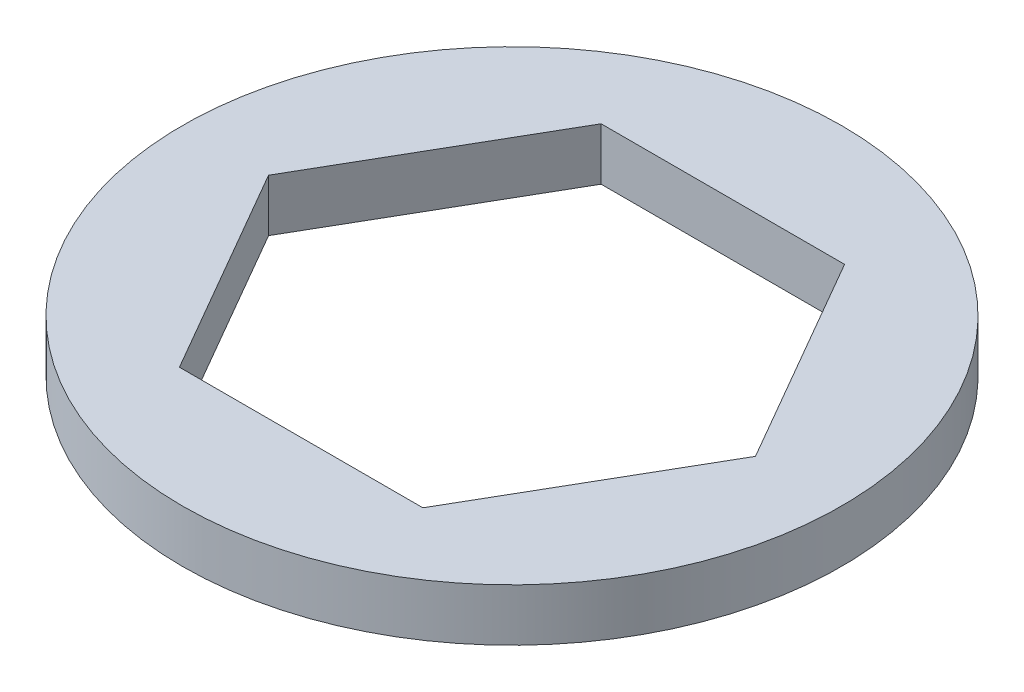
ISO-10303-21;
HEADER;
FILE_DESCRIPTION(('STEP AP214'),'2;1');
FILE_NAME('part.step','',(''),(''),'','','');
FILE_SCHEMA(('AUTOMOTIVE_DESIGN { 1 0 10303 214 1 1 1 1 }'));
ENDSEC;
DATA;
#1=APPLICATION_CONTEXT('core data for automotive mechanical design processes');
#2=APPLICATION_PROTOCOL_DEFINITION('international standard','automotive_design',2000,#1);
#3=PRODUCT_CONTEXT('',#1,'mechanical');
#4=PRODUCT('Part','Part','',(#3));
#5=PRODUCT_RELATED_PRODUCT_CATEGORY('part','',(#4));
#6=PRODUCT_DEFINITION_FORMATION('','',#4);
#7=PRODUCT_DEFINITION_CONTEXT('part definition',#1,'design');
#8=PRODUCT_DEFINITION('design','',#6,#7);
#9=PRODUCT_DEFINITION_SHAPE('','',#8);
#10=(LENGTH_UNIT() NAMED_UNIT(*) SI_UNIT(.MILLI.,.METRE.));
#11=(NAMED_UNIT(*) PLANE_ANGLE_UNIT() SI_UNIT($,.RADIAN.));
#12=(NAMED_UNIT(*) SI_UNIT($,.STERADIAN.) SOLID_ANGLE_UNIT());
#13=UNCERTAINTY_MEASURE_WITH_UNIT(LENGTH_MEASURE(1.E-05),#10,'distance_accuracy_value','');
#14=(GEOMETRIC_REPRESENTATION_CONTEXT(3) GLOBAL_UNCERTAINTY_ASSIGNED_CONTEXT((#13)) GLOBAL_UNIT_ASSIGNED_CONTEXT((#10,
#11,#12)) REPRESENTATION_CONTEXT('',''));
#15=CARTESIAN_POINT('',(0.,0.,0.));
#16=DIRECTION('',(0.,0.,1.));
#17=DIRECTION('',(1.,0.,0.));
#18=AXIS2_PLACEMENT_3D('',#15,#16,#17);
#19=CARTESIAN_POINT('',(0.,1.5875,0.));
#20=DIRECTION('',(0.,1.,0.));
#21=DIRECTION('',(0.,0.,1.));
#22=AXIS2_PLACEMENT_3D('',#19,#20,#21);
#23=PLANE('',#22);
#24=CARTESIAN_POINT('',(0.,1.5875,0.));
#25=DIRECTION('',(0.,1.,0.));
#26=DIRECTION('',(0.,0.,1.));
#27=AXIS2_PLACEMENT_3D('',#24,#25,#26);
#28=CIRCLE('',#27,9.9949);
#29=CARTESIAN_POINT('',(0.,1.5875,9.9949));
#30=VERTEX_POINT('',#29);
#31=EDGE_CURVE('E11',#30,#30,#28,.T.);
#32=ORIENTED_EDGE('',*,*,#31,.T.);
#33=EDGE_LOOP('',(#32));
#34=FACE_BOUND('',#33,.T.);
#35=DIRECTION('',(-0.500000000000001,0.,-0.866025403784438));
#36=VECTOR('',#35,1.);
#37=CARTESIAN_POINT('',(7.38367485763918,1.5875,0.));
#38=LINE('',#37,#36);
#39=CARTESIAN_POINT('',(7.38367485763918,1.5875,0.));
#40=VERTEX_POINT('',#39);
#41=CARTESIAN_POINT('',(3.69183742881957,1.5875,-6.39444999999998));
#42=VERTEX_POINT('',#41);
#43=EDGE_CURVE('E94',#40,#42,#38,.T.);
#44=ORIENTED_EDGE('',*,*,#43,.F.);
#45=DIRECTION('',(0.499999999999995,0.,-0.866025403784441));
#46=VECTOR('',#45,1.);
#47=CARTESIAN_POINT('',(3.69183742881966,1.5875,6.39444999999993));
#48=LINE('',#47,#46);
#49=CARTESIAN_POINT('',(3.69183742881966,1.5875,6.39444999999993));
#50=VERTEX_POINT('',#49);
#51=EDGE_CURVE('E86',#50,#40,#48,.T.);
#52=ORIENTED_EDGE('',*,*,#51,.F.);
#53=DIRECTION('',(1.,0.,0.));
#54=VECTOR('',#53,1.);
#55=CARTESIAN_POINT('',(-3.69183742881953,1.5875,6.39445000000001));
#56=LINE('',#55,#54);
#57=CARTESIAN_POINT('',(-3.69183742881953,1.5875,6.39445000000001));
#58=VERTEX_POINT('',#57);
#59=EDGE_CURVE('E114',#58,#50,#56,.T.);
#60=ORIENTED_EDGE('',*,*,#59,.F.);
#61=DIRECTION('',(0.500000000000007,0.,0.866025403784434));
#62=VECTOR('',#61,1.);
#63=CARTESIAN_POINT('',(-7.38367485763918,1.5875,0.));
#64=LINE('',#63,#62);
#65=CARTESIAN_POINT('',(-7.38367485763918,1.5875,0.));
#66=VERTEX_POINT('',#65);
#67=EDGE_CURVE('E112',#66,#58,#64,.T.);
#68=ORIENTED_EDGE('',*,*,#67,.F.);
#69=DIRECTION('',(-0.499999999999995,0.,0.866025403784442));
#70=VECTOR('',#69,1.);
#71=CARTESIAN_POINT('',(-3.69183742881962,1.5875,-6.39444999999996));
#72=LINE('',#71,#70);
#73=CARTESIAN_POINT('',(-3.69183742881962,1.5875,-6.39444999999996));
#74=VERTEX_POINT('',#73);
#75=EDGE_CURVE('E108',#74,#66,#72,.T.);
#76=ORIENTED_EDGE('',*,*,#75,.F.);
#77=DIRECTION('',(-1.,0.,0.));
#78=VECTOR('',#77,1.);
#79=CARTESIAN_POINT('',(3.69183742881957,1.5875,-6.39444999999998));
#80=LINE('',#79,#78);
#81=EDGE_CURVE('E106',#42,#74,#80,.T.);
#82=ORIENTED_EDGE('',*,*,#81,.F.);
#83=EDGE_LOOP('',(#44,#52,#60,#68,#76,#82));
#84=FACE_BOUND('',#83,.T.);
#85=ADVANCED_FACE('F33',(#34,#84),#23,.T.);
#86=CARTESIAN_POINT('',(0.,0.,0.));
#87=DIRECTION('',(0.,1.,0.));
#88=DIRECTION('',(0.,0.,1.));
#89=AXIS2_PLACEMENT_3D('',#86,#87,#88);
#90=PLANE('',#89);
#91=CARTESIAN_POINT('',(0.,0.,0.));
#92=DIRECTION('',(0.,1.,0.));
#93=DIRECTION('',(0.,0.,1.));
#94=AXIS2_PLACEMENT_3D('',#91,#92,#93);
#95=CIRCLE('',#94,9.9949);
#96=CARTESIAN_POINT('',(0.,0.,9.9949));
#97=VERTEX_POINT('',#96);
#98=EDGE_CURVE('E37',#97,#97,#95,.T.);
#99=ORIENTED_EDGE('',*,*,#98,.F.);
#100=EDGE_LOOP('',(#99));
#101=FACE_BOUND('',#100,.T.);
#102=DIRECTION('',(0.499999999999995,0.,-0.866025403784441));
#103=VECTOR('',#102,1.);
#104=CARTESIAN_POINT('',(3.69183742881966,0.,6.39444999999993));
#105=LINE('',#104,#103);
#106=CARTESIAN_POINT('',(3.69183742881966,0.,6.39444999999993));
#107=VERTEX_POINT('',#106);
#108=CARTESIAN_POINT('',(7.38367485763918,0.,0.));
#109=VERTEX_POINT('',#108);
#110=EDGE_CURVE('E56',#107,#109,#105,.T.);
#111=ORIENTED_EDGE('',*,*,#110,.T.);
#112=DIRECTION('',(-0.500000000000001,0.,-0.866025403784438));
#113=VECTOR('',#112,1.);
#114=CARTESIAN_POINT('',(7.38367485763918,0.,0.));
#115=LINE('',#114,#113);
#116=CARTESIAN_POINT('',(3.69183742881957,0.,-6.39444999999998));
#117=VERTEX_POINT('',#116);
#118=EDGE_CURVE('E101',#109,#117,#115,.T.);
#119=ORIENTED_EDGE('',*,*,#118,.T.);
#120=DIRECTION('',(-1.,0.,0.));
#121=VECTOR('',#120,1.);
#122=CARTESIAN_POINT('',(3.69183742881957,0.,-6.39444999999998));
#123=LINE('',#122,#121);
#124=CARTESIAN_POINT('',(-3.69183742881962,0.,-6.39444999999996));
#125=VERTEX_POINT('',#124);
#126=EDGE_CURVE('E118',#117,#125,#123,.T.);
#127=ORIENTED_EDGE('',*,*,#126,.T.);
#128=DIRECTION('',(-0.499999999999995,0.,0.866025403784442));
#129=VECTOR('',#128,1.);
#130=CARTESIAN_POINT('',(-3.69183742881962,0.,-6.39444999999996));
#131=LINE('',#130,#129);
#132=CARTESIAN_POINT('',(-7.38367485763918,0.,0.));
#133=VERTEX_POINT('',#132);
#134=EDGE_CURVE('E121',#125,#133,#131,.T.);
#135=ORIENTED_EDGE('',*,*,#134,.T.);
#136=DIRECTION('',(0.500000000000007,0.,0.866025403784434));
#137=VECTOR('',#136,1.);
#138=CARTESIAN_POINT('',(-7.38367485763918,0.,0.));
#139=LINE('',#138,#137);
#140=CARTESIAN_POINT('',(-3.69183742881953,0.,6.39445000000001));
#141=VERTEX_POINT('',#140);
#142=EDGE_CURVE('E124',#133,#141,#139,.T.);
#143=ORIENTED_EDGE('',*,*,#142,.T.);
#144=DIRECTION('',(1.,0.,0.));
#145=VECTOR('',#144,1.);
#146=CARTESIAN_POINT('',(-3.69183742881953,0.,6.39445000000001));
#147=LINE('',#146,#145);
#148=EDGE_CURVE('E95',#141,#107,#147,.T.);
#149=ORIENTED_EDGE('',*,*,#148,.T.);
#150=EDGE_LOOP('',(#111,#119,#127,#135,#143,#149));
#151=FACE_BOUND('',#150,.T.);
#152=ADVANCED_FACE('F141',(#101,#151),#90,.F.);
#153=CARTESIAN_POINT('',(0.,1.5875,0.));
#154=DIRECTION('',(0.,-1.,0.));
#155=DIRECTION('',(0.,0.,-1.));
#156=AXIS2_PLACEMENT_3D('',#153,#154,#155);
#157=CYLINDRICAL_SURFACE('',#156,9.9949);
#158=ORIENTED_EDGE('',*,*,#31,.F.);
#159=EDGE_LOOP('',(#158));
#160=FACE_BOUND('',#159,.T.);
#161=ORIENTED_EDGE('',*,*,#98,.T.);
#162=EDGE_LOOP('',(#161));
#163=FACE_BOUND('',#162,.T.);
#164=ADVANCED_FACE('F35',(#160,#163),#157,.T.);
#165=CARTESIAN_POINT('',(3.69183742881966,1.5875,6.39444999999993));
#166=DIRECTION('',(-0.866025403784441,0.,-0.499999999999995));
#167=DIRECTION('',(-0.499999999999995,0.,0.866025403784441));
#168=AXIS2_PLACEMENT_3D('',#165,#166,#167);
#169=PLANE('',#168);
#170=ORIENTED_EDGE('',*,*,#110,.F.);
#171=DIRECTION('',(0.,-1.,0.));
#172=VECTOR('',#171,1.);
#173=CARTESIAN_POINT('',(3.69183742881966,1.5875,6.39444999999993));
#174=LINE('',#173,#172);
#175=EDGE_CURVE('E90',#50,#107,#174,.T.);
#176=ORIENTED_EDGE('',*,*,#175,.F.);
#177=ORIENTED_EDGE('',*,*,#51,.T.);
#178=DIRECTION('',(0.,-1.,0.));
#179=VECTOR('',#178,1.);
#180=CARTESIAN_POINT('',(7.38367485763918,1.5875,0.));
#181=LINE('',#180,#179);
#182=EDGE_CURVE('E89',#40,#109,#181,.T.);
#183=ORIENTED_EDGE('',*,*,#182,.T.);
#184=EDGE_LOOP('',(#170,#176,#177,#183));
#185=FACE_BOUND('',#184,.T.);
#186=ADVANCED_FACE('F88',(#185),#169,.T.);
#187=CARTESIAN_POINT('',(7.38367485763918,1.5875,0.));
#188=DIRECTION('',(-0.866025403784438,0.,0.500000000000001));
#189=DIRECTION('',(0.500000000000001,0.,0.866025403784438));
#190=AXIS2_PLACEMENT_3D('',#187,#188,#189);
#191=PLANE('',#190);
#192=ORIENTED_EDGE('',*,*,#118,.F.);
#193=ORIENTED_EDGE('',*,*,#182,.F.);
#194=ORIENTED_EDGE('',*,*,#43,.T.);
#195=DIRECTION('',(0.,-1.,0.));
#196=VECTOR('',#195,1.);
#197=CARTESIAN_POINT('',(3.69183742881957,1.5875,-6.39444999999998));
#198=LINE('',#197,#196);
#199=EDGE_CURVE('E102',#42,#117,#198,.T.);
#200=ORIENTED_EDGE('',*,*,#199,.T.);
#201=EDGE_LOOP('',(#192,#193,#194,#200));
#202=FACE_BOUND('',#201,.T.);
#203=ADVANCED_FACE('F98',(#202),#191,.T.);
#204=CARTESIAN_POINT('',(3.69183742881957,1.5875,-6.39444999999998));
#205=DIRECTION('',(0.,0.,1.));
#206=DIRECTION('',(1.,0.,0.));
#207=AXIS2_PLACEMENT_3D('',#204,#205,#206);
#208=PLANE('',#207);
#209=ORIENTED_EDGE('',*,*,#126,.F.);
#210=ORIENTED_EDGE('',*,*,#199,.F.);
#211=ORIENTED_EDGE('',*,*,#81,.T.);
#212=DIRECTION('',(0.,-1.,0.));
#213=VECTOR('',#212,1.);
#214=CARTESIAN_POINT('',(-3.69183742881962,1.5875,-6.39444999999996));
#215=LINE('',#214,#213);
#216=EDGE_CURVE('E133',#74,#125,#215,.T.);
#217=ORIENTED_EDGE('',*,*,#216,.T.);
#218=EDGE_LOOP('',(#209,#210,#211,#217));
#219=FACE_BOUND('',#218,.T.);
#220=ADVANCED_FACE('F137',(#219),#208,.T.);
#221=CARTESIAN_POINT('',(-3.69183742881962,1.5875,-6.39444999999996));
#222=DIRECTION('',(0.866025403784442,0.,0.499999999999995));
#223=DIRECTION('',(0.499999999999995,0.,-0.866025403784442));
#224=AXIS2_PLACEMENT_3D('',#221,#222,#223);
#225=PLANE('',#224);
#226=ORIENTED_EDGE('',*,*,#134,.F.);
#227=ORIENTED_EDGE('',*,*,#216,.F.);
#228=ORIENTED_EDGE('',*,*,#75,.T.);
#229=DIRECTION('',(0.,-1.,0.));
#230=VECTOR('',#229,1.);
#231=CARTESIAN_POINT('',(-7.38367485763918,1.5875,0.));
#232=LINE('',#231,#230);
#233=EDGE_CURVE('E131',#66,#133,#232,.T.);
#234=ORIENTED_EDGE('',*,*,#233,.T.);
#235=EDGE_LOOP('',(#226,#227,#228,#234));
#236=FACE_BOUND('',#235,.T.);
#237=ADVANCED_FACE('F149',(#236),#225,.T.);
#238=CARTESIAN_POINT('',(-7.38367485763918,1.5875,0.));
#239=DIRECTION('',(0.866025403784435,0.,-0.500000000000007));
#240=DIRECTION('',(-0.500000000000007,0.,-0.866025403784435));
#241=AXIS2_PLACEMENT_3D('',#238,#239,#240);
#242=PLANE('',#241);
#243=ORIENTED_EDGE('',*,*,#142,.F.);
#244=ORIENTED_EDGE('',*,*,#233,.F.);
#245=ORIENTED_EDGE('',*,*,#67,.T.);
#246=DIRECTION('',(0.,-1.,0.));
#247=VECTOR('',#246,1.);
#248=CARTESIAN_POINT('',(-3.69183742881953,1.5875,6.39445000000001));
#249=LINE('',#248,#247);
#250=EDGE_CURVE('E48',#58,#141,#249,.T.);
#251=ORIENTED_EDGE('',*,*,#250,.T.);
#252=EDGE_LOOP('',(#243,#244,#245,#251));
#253=FACE_BOUND('',#252,.T.);
#254=ADVANCED_FACE('F147',(#253),#242,.T.);
#255=CARTESIAN_POINT('',(-3.69183742881953,1.5875,6.39445000000001));
#256=DIRECTION('',(0.,0.,-1.));
#257=DIRECTION('',(-1.,0.,0.));
#258=AXIS2_PLACEMENT_3D('',#255,#256,#257);
#259=PLANE('',#258);
#260=ORIENTED_EDGE('',*,*,#148,.F.);
#261=ORIENTED_EDGE('',*,*,#250,.F.);
#262=ORIENTED_EDGE('',*,*,#59,.T.);
#263=ORIENTED_EDGE('',*,*,#175,.T.);
#264=EDGE_LOOP('',(#260,#261,#262,#263));
#265=FACE_BOUND('',#264,.T.);
#266=ADVANCED_FACE('F143',(#265),#259,.T.);
#267=CLOSED_SHELL('',(#85,#152,#164,#186,#203,#220,#237,#254,#266));
#268=MANIFOLD_SOLID_BREP('B2',#267);
#269=ADVANCED_BREP_SHAPE_REPRESENTATION('',(#18,#268),#14);
#270=SHAPE_DEFINITION_REPRESENTATION(#9,#269);
ENDSEC;
END-ISO-10303-21;
